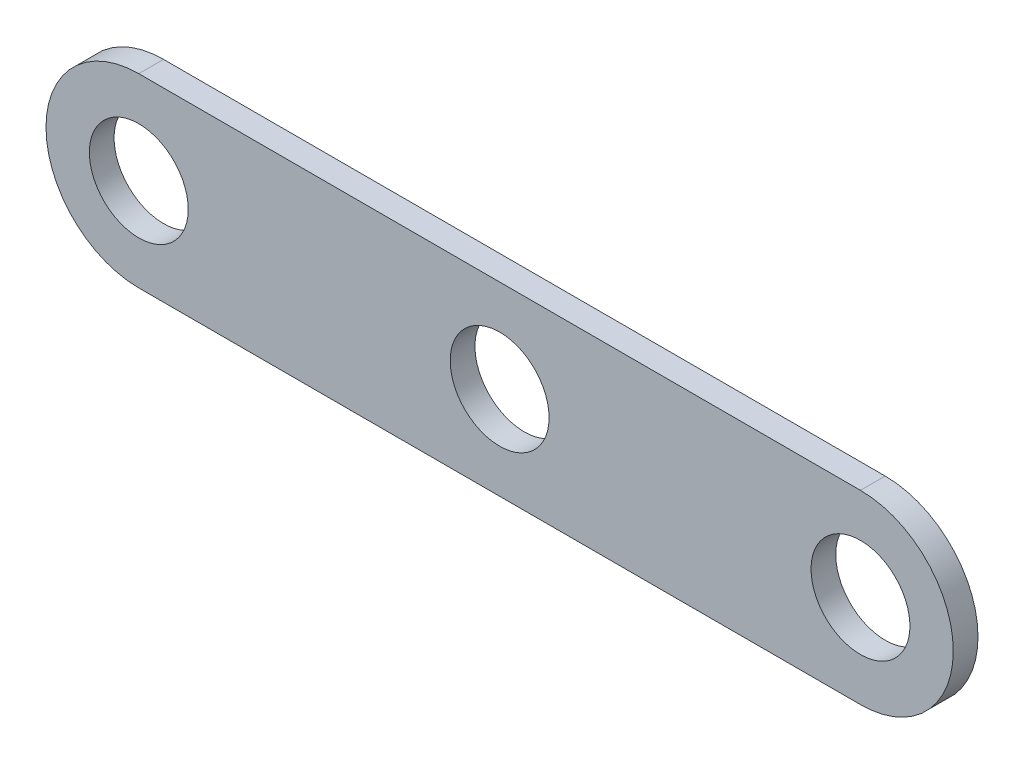
ISO-10303-21;
HEADER;
FILE_DESCRIPTION(('STEP AP214'),'2;1');
FILE_NAME('part.step','',(''),(''),'','','');
FILE_SCHEMA(('AUTOMOTIVE_DESIGN { 1 0 10303 214 1 1 1 1 }'));
ENDSEC;
DATA;
#1=APPLICATION_CONTEXT('core data for automotive mechanical design processes');
#2=APPLICATION_PROTOCOL_DEFINITION('international standard','automotive_design',2000,#1);
#3=PRODUCT_CONTEXT('',#1,'mechanical');
#4=PRODUCT('Part','Part','',(#3));
#5=PRODUCT_RELATED_PRODUCT_CATEGORY('part','',(#4));
#6=PRODUCT_DEFINITION_FORMATION('','',#4);
#7=PRODUCT_DEFINITION_CONTEXT('part definition',#1,'design');
#8=PRODUCT_DEFINITION('design','',#6,#7);
#9=PRODUCT_DEFINITION_SHAPE('','',#8);
#10=(LENGTH_UNIT() NAMED_UNIT(*) SI_UNIT(.MILLI.,.METRE.));
#11=(NAMED_UNIT(*) PLANE_ANGLE_UNIT() SI_UNIT($,.RADIAN.));
#12=(NAMED_UNIT(*) SI_UNIT($,.STERADIAN.) SOLID_ANGLE_UNIT());
#13=UNCERTAINTY_MEASURE_WITH_UNIT(LENGTH_MEASURE(1.E-05),#10,'distance_accuracy_value','');
#14=(GEOMETRIC_REPRESENTATION_CONTEXT(3) GLOBAL_UNCERTAINTY_ASSIGNED_CONTEXT((#13)) GLOBAL_UNIT_ASSIGNED_CONTEXT((#10,
#11,#12)) REPRESENTATION_CONTEXT('',''));
#15=CARTESIAN_POINT('',(0.,0.,0.));
#16=DIRECTION('',(0.,0.,1.));
#17=DIRECTION('',(1.,0.,0.));
#18=AXIS2_PLACEMENT_3D('',#15,#16,#17);
#19=CARTESIAN_POINT('',(87.5,0.,6.));
#20=DIRECTION('',(0.,0.,1.));
#21=DIRECTION('',(1.,0.,0.));
#22=AXIS2_PLACEMENT_3D('',#19,#20,#21);
#23=PLANE('',#22);
#24=CARTESIAN_POINT('',(87.5,0.,6.));
#25=DIRECTION('',(0.,0.,1.));
#26=DIRECTION('',(-1.,0.,0.));
#27=AXIS2_PLACEMENT_3D('',#24,#25,#26);
#28=CIRCLE('',#27,11.99);
#29=CARTESIAN_POINT('',(75.51,0.,6.));
#30=VERTEX_POINT('',#29);
#31=EDGE_CURVE('E121',#30,#30,#28,.T.);
#32=ORIENTED_EDGE('',*,*,#31,.F.);
#33=EDGE_LOOP('',(#32));
#34=FACE_BOUND('',#33,.T.);
#35=CARTESIAN_POINT('',(87.5,0.,6.));
#36=DIRECTION('',(0.,0.,1.));
#37=DIRECTION('',(1.,0.,0.));
#38=AXIS2_PLACEMENT_3D('',#35,#36,#37);
#39=CIRCLE('',#38,22.5);
#40=CARTESIAN_POINT('',(87.5,-22.5,6.));
#41=VERTEX_POINT('',#40);
#42=CARTESIAN_POINT('',(87.5,22.5,6.));
#43=VERTEX_POINT('',#42);
#44=EDGE_CURVE('E91',#41,#43,#39,.T.);
#45=ORIENTED_EDGE('',*,*,#44,.T.);
#46=DIRECTION('',(-1.,0.,0.));
#47=VECTOR('',#46,1.);
#48=CARTESIAN_POINT('',(-87.5,22.5,6.));
#49=LINE('',#48,#47);
#50=CARTESIAN_POINT('',(-87.5,22.5,6.));
#51=VERTEX_POINT('',#50);
#52=EDGE_CURVE('E86',#43,#51,#49,.T.);
#53=ORIENTED_EDGE('',*,*,#52,.T.);
#54=CARTESIAN_POINT('',(-87.5,0.,6.));
#55=DIRECTION('',(0.,0.,1.));
#56=DIRECTION('',(-1.,0.,0.));
#57=AXIS2_PLACEMENT_3D('',#54,#55,#56);
#58=CIRCLE('',#57,22.5);
#59=CARTESIAN_POINT('',(-87.5,-22.5,6.));
#60=VERTEX_POINT('',#59);
#61=EDGE_CURVE('E89',#51,#60,#58,.T.);
#62=ORIENTED_EDGE('',*,*,#61,.T.);
#63=DIRECTION('',(1.,0.,0.));
#64=VECTOR('',#63,1.);
#65=CARTESIAN_POINT('',(-87.5,-22.5,6.));
#66=LINE('',#65,#64);
#67=EDGE_CURVE('E56',#60,#41,#66,.T.);
#68=ORIENTED_EDGE('',*,*,#67,.T.);
#69=EDGE_LOOP('',(#45,#53,#62,#68));
#70=FACE_BOUND('',#69,.T.);
#71=CARTESIAN_POINT('',(-87.5,0.,6.));
#72=DIRECTION('',(0.,0.,1.));
#73=DIRECTION('',(1.,0.,0.));
#74=AXIS2_PLACEMENT_3D('',#71,#72,#73);
#75=CIRCLE('',#74,11.99);
#76=CARTESIAN_POINT('',(-75.51,0.,6.));
#77=VERTEX_POINT('',#76);
#78=EDGE_CURVE('E106',#77,#77,#75,.T.);
#79=ORIENTED_EDGE('',*,*,#78,.F.);
#80=EDGE_LOOP('',(#79));
#81=FACE_BOUND('',#80,.T.);
#82=CARTESIAN_POINT('',(0.,0.,6.));
#83=DIRECTION('',(0.,0.,1.));
#84=DIRECTION('',(1.,0.,0.));
#85=AXIS2_PLACEMENT_3D('',#82,#83,#84);
#86=CIRCLE('',#85,11.99);
#87=CARTESIAN_POINT('',(11.99,0.,6.));
#88=VERTEX_POINT('',#87);
#89=EDGE_CURVE('E127',#88,#88,#86,.T.);
#90=ORIENTED_EDGE('',*,*,#89,.F.);
#91=EDGE_LOOP('',(#90));
#92=FACE_BOUND('',#91,.T.);
#93=ADVANCED_FACE('F39',(#34,#70,#81,#92),#23,.T.);
#94=CARTESIAN_POINT('',(87.5,0.,0.));
#95=DIRECTION('',(0.,0.,1.));
#96=DIRECTION('',(1.,0.,0.));
#97=AXIS2_PLACEMENT_3D('',#94,#95,#96);
#98=PLANE('',#97);
#99=CARTESIAN_POINT('',(87.5,0.,0.));
#100=DIRECTION('',(0.,0.,1.));
#101=DIRECTION('',(1.,0.,0.));
#102=AXIS2_PLACEMENT_3D('',#99,#100,#101);
#103=CIRCLE('',#102,22.5);
#104=CARTESIAN_POINT('',(87.5,-22.5,0.));
#105=VERTEX_POINT('',#104);
#106=CARTESIAN_POINT('',(87.5,22.5,0.));
#107=VERTEX_POINT('',#106);
#108=EDGE_CURVE('E103',#105,#107,#103,.T.);
#109=ORIENTED_EDGE('',*,*,#108,.F.);
#110=DIRECTION('',(1.,0.,0.));
#111=VECTOR('',#110,1.);
#112=CARTESIAN_POINT('',(-87.5,-22.5,0.));
#113=LINE('',#112,#111);
#114=CARTESIAN_POINT('',(-87.5,-22.5,0.));
#115=VERTEX_POINT('',#114);
#116=EDGE_CURVE('E79',#115,#105,#113,.T.);
#117=ORIENTED_EDGE('',*,*,#116,.F.);
#118=CARTESIAN_POINT('',(-87.5,0.,0.));
#119=DIRECTION('',(0.,0.,1.));
#120=DIRECTION('',(-1.,0.,0.));
#121=AXIS2_PLACEMENT_3D('',#118,#119,#120);
#122=CIRCLE('',#121,22.5);
#123=CARTESIAN_POINT('',(-87.5,22.5,0.));
#124=VERTEX_POINT('',#123);
#125=EDGE_CURVE('E73',#124,#115,#122,.T.);
#126=ORIENTED_EDGE('',*,*,#125,.F.);
#127=DIRECTION('',(-1.,0.,0.));
#128=VECTOR('',#127,1.);
#129=CARTESIAN_POINT('',(-87.5,22.5,0.));
#130=LINE('',#129,#128);
#131=EDGE_CURVE('E95',#107,#124,#130,.T.);
#132=ORIENTED_EDGE('',*,*,#131,.F.);
#133=EDGE_LOOP('',(#109,#117,#126,#132));
#134=FACE_BOUND('',#133,.T.);
#135=CARTESIAN_POINT('',(-87.5,0.,0.));
#136=DIRECTION('',(0.,0.,1.));
#137=DIRECTION('',(1.,0.,0.));
#138=AXIS2_PLACEMENT_3D('',#135,#136,#137);
#139=CIRCLE('',#138,11.99);
#140=CARTESIAN_POINT('',(-75.51,0.,0.));
#141=VERTEX_POINT('',#140);
#142=EDGE_CURVE('E118',#141,#141,#139,.T.);
#143=ORIENTED_EDGE('',*,*,#142,.T.);
#144=EDGE_LOOP('',(#143));
#145=FACE_BOUND('',#144,.T.);
#146=CARTESIAN_POINT('',(87.5,0.,0.));
#147=DIRECTION('',(0.,0.,1.));
#148=DIRECTION('',(-1.,0.,0.));
#149=AXIS2_PLACEMENT_3D('',#146,#147,#148);
#150=CIRCLE('',#149,11.99);
#151=CARTESIAN_POINT('',(75.51,0.,0.));
#152=VERTEX_POINT('',#151);
#153=EDGE_CURVE('E124',#152,#152,#150,.T.);
#154=ORIENTED_EDGE('',*,*,#153,.T.);
#155=EDGE_LOOP('',(#154));
#156=FACE_BOUND('',#155,.T.);
#157=CARTESIAN_POINT('',(0.,0.,0.));
#158=DIRECTION('',(0.,0.,1.));
#159=DIRECTION('',(1.,0.,0.));
#160=AXIS2_PLACEMENT_3D('',#157,#158,#159);
#161=CIRCLE('',#160,11.99);
#162=CARTESIAN_POINT('',(11.99,0.,0.));
#163=VERTEX_POINT('',#162);
#164=EDGE_CURVE('E130',#163,#163,#161,.T.);
#165=ORIENTED_EDGE('',*,*,#164,.T.);
#166=EDGE_LOOP('',(#165));
#167=FACE_BOUND('',#166,.T.);
#168=ADVANCED_FACE('F114',(#134,#145,#156,#167),#98,.F.);
#169=CARTESIAN_POINT('',(87.5,0.,6.));
#170=DIRECTION('',(0.,0.,-1.));
#171=DIRECTION('',(-1.,0.,0.));
#172=AXIS2_PLACEMENT_3D('',#169,#170,#171);
#173=CYLINDRICAL_SURFACE('',#172,22.5);
#174=ORIENTED_EDGE('',*,*,#108,.T.);
#175=DIRECTION('',(0.,0.,-1.));
#176=VECTOR('',#175,1.);
#177=CARTESIAN_POINT('',(87.5,22.5,6.));
#178=LINE('',#177,#176);
#179=EDGE_CURVE('E11',#43,#107,#178,.T.);
#180=ORIENTED_EDGE('',*,*,#179,.F.);
#181=ORIENTED_EDGE('',*,*,#44,.F.);
#182=DIRECTION('',(0.,0.,-1.));
#183=VECTOR('',#182,1.);
#184=CARTESIAN_POINT('',(87.5,-22.5,6.));
#185=LINE('',#184,#183);
#186=EDGE_CURVE('E99',#41,#105,#185,.T.);
#187=ORIENTED_EDGE('',*,*,#186,.T.);
#188=EDGE_LOOP('',(#174,#180,#181,#187));
#189=FACE_BOUND('',#188,.T.);
#190=ADVANCED_FACE('F41',(#189),#173,.T.);
#191=CARTESIAN_POINT('',(-87.5,22.5,6.));
#192=DIRECTION('',(0.,-1.,0.));
#193=DIRECTION('',(0.,0.,-1.));
#194=AXIS2_PLACEMENT_3D('',#191,#192,#193);
#195=PLANE('',#194);
#196=ORIENTED_EDGE('',*,*,#131,.T.);
#197=DIRECTION('',(0.,0.,-1.));
#198=VECTOR('',#197,1.);
#199=CARTESIAN_POINT('',(-87.5,22.5,6.));
#200=LINE('',#199,#198);
#201=EDGE_CURVE('E48',#51,#124,#200,.T.);
#202=ORIENTED_EDGE('',*,*,#201,.F.);
#203=ORIENTED_EDGE('',*,*,#52,.F.);
#204=ORIENTED_EDGE('',*,*,#179,.T.);
#205=EDGE_LOOP('',(#196,#202,#203,#204));
#206=FACE_BOUND('',#205,.T.);
#207=ADVANCED_FACE('F94',(#206),#195,.F.);
#208=CARTESIAN_POINT('',(-87.5,0.,6.));
#209=DIRECTION('',(0.,0.,-1.));
#210=DIRECTION('',(-1.,0.,0.));
#211=AXIS2_PLACEMENT_3D('',#208,#209,#210);
#212=CYLINDRICAL_SURFACE('',#211,22.5);
#213=ORIENTED_EDGE('',*,*,#125,.T.);
#214=DIRECTION('',(0.,0.,-1.));
#215=VECTOR('',#214,1.);
#216=CARTESIAN_POINT('',(-87.5,-22.5,6.));
#217=LINE('',#216,#215);
#218=EDGE_CURVE('E96',#60,#115,#217,.T.);
#219=ORIENTED_EDGE('',*,*,#218,.F.);
#220=ORIENTED_EDGE('',*,*,#61,.F.);
#221=ORIENTED_EDGE('',*,*,#201,.T.);
#222=EDGE_LOOP('',(#213,#219,#220,#221));
#223=FACE_BOUND('',#222,.T.);
#224=ADVANCED_FACE('F97',(#223),#212,.T.);
#225=CARTESIAN_POINT('',(-87.5,-22.5,6.));
#226=DIRECTION('',(0.,1.,0.));
#227=DIRECTION('',(-1.,0.,0.));
#228=AXIS2_PLACEMENT_3D('',#225,#226,#227);
#229=PLANE('',#228);
#230=ORIENTED_EDGE('',*,*,#116,.T.);
#231=ORIENTED_EDGE('',*,*,#186,.F.);
#232=ORIENTED_EDGE('',*,*,#67,.F.);
#233=ORIENTED_EDGE('',*,*,#218,.T.);
#234=EDGE_LOOP('',(#230,#231,#232,#233));
#235=FACE_BOUND('',#234,.T.);
#236=ADVANCED_FACE('F111',(#235),#229,.F.);
#237=CARTESIAN_POINT('',(-87.5,0.,6.));
#238=DIRECTION('',(0.,0.,-1.));
#239=DIRECTION('',(-1.,0.,0.));
#240=AXIS2_PLACEMENT_3D('',#237,#238,#239);
#241=CYLINDRICAL_SURFACE('',#240,11.99);
#242=ORIENTED_EDGE('',*,*,#78,.T.);
#243=EDGE_LOOP('',(#242));
#244=FACE_BOUND('',#243,.T.);
#245=ORIENTED_EDGE('',*,*,#142,.F.);
#246=EDGE_LOOP('',(#245));
#247=FACE_BOUND('',#246,.T.);
#248=ADVANCED_FACE('F148',(#244,#247),#241,.F.);
#249=CARTESIAN_POINT('',(87.5,0.,6.));
#250=DIRECTION('',(0.,0.,-1.));
#251=DIRECTION('',(-1.,0.,0.));
#252=AXIS2_PLACEMENT_3D('',#249,#250,#251);
#253=CYLINDRICAL_SURFACE('',#252,11.99);
#254=ORIENTED_EDGE('',*,*,#31,.T.);
#255=EDGE_LOOP('',(#254));
#256=FACE_BOUND('',#255,.T.);
#257=ORIENTED_EDGE('',*,*,#153,.F.);
#258=EDGE_LOOP('',(#257));
#259=FACE_BOUND('',#258,.T.);
#260=ADVANCED_FACE('F193',(#256,#259),#253,.F.);
#261=CARTESIAN_POINT('',(0.,0.,6.));
#262=DIRECTION('',(0.,0.,-1.));
#263=DIRECTION('',(-1.,0.,0.));
#264=AXIS2_PLACEMENT_3D('',#261,#262,#263);
#265=CYLINDRICAL_SURFACE('',#264,11.99);
#266=ORIENTED_EDGE('',*,*,#89,.T.);
#267=EDGE_LOOP('',(#266));
#268=FACE_BOUND('',#267,.T.);
#269=ORIENTED_EDGE('',*,*,#164,.F.);
#270=EDGE_LOOP('',(#269));
#271=FACE_BOUND('',#270,.T.);
#272=ADVANCED_FACE('F136',(#268,#271),#265,.F.);
#273=CLOSED_SHELL('',(#93,#168,#190,#207,#224,#236,#248,#260,#272));
#274=MANIFOLD_SOLID_BREP('B2',#273);
#275=ADVANCED_BREP_SHAPE_REPRESENTATION('',(#18,#274),#14);
#276=SHAPE_DEFINITION_REPRESENTATION(#9,#275);
ENDSEC;
END-ISO-10303-21;
